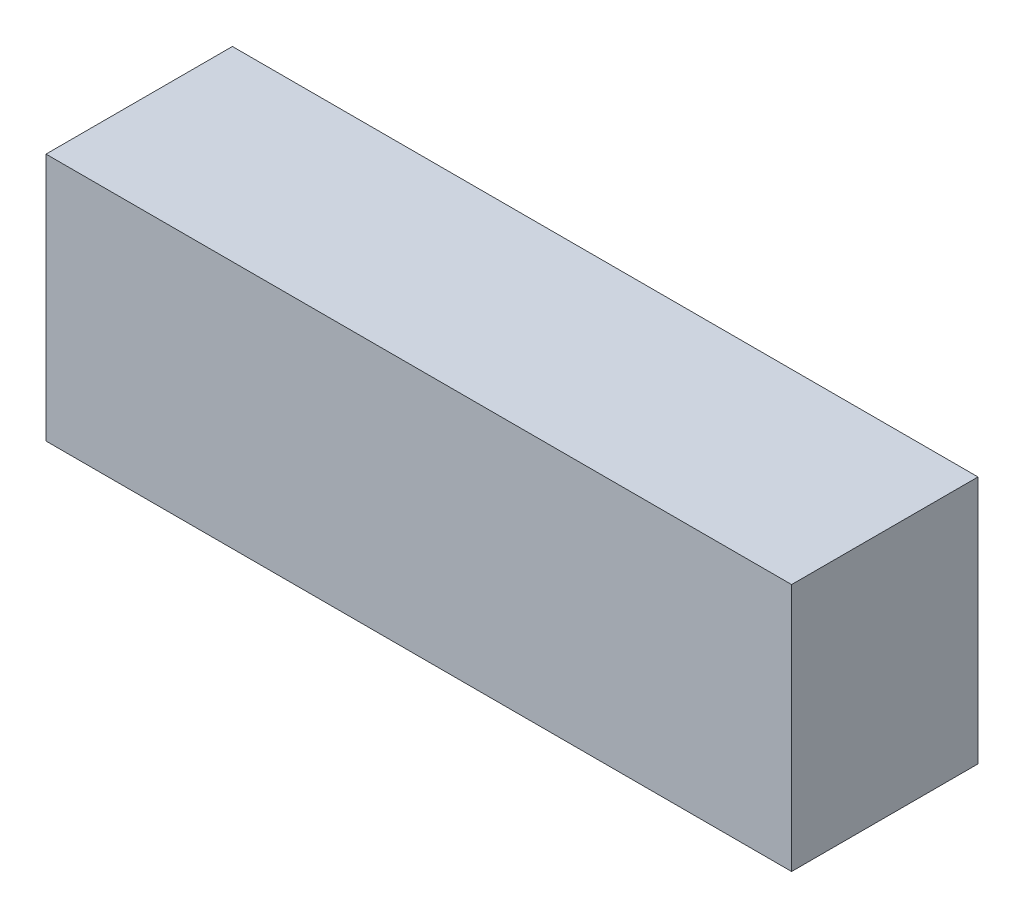
ISO-10303-21;
HEADER;
FILE_DESCRIPTION(('STEP AP214'),'2;1');
FILE_NAME('part.step','',(''),(''),'','','');
FILE_SCHEMA(('AUTOMOTIVE_DESIGN { 1 0 10303 214 1 1 1 1 }'));
ENDSEC;
DATA;
#1=APPLICATION_CONTEXT('core data for automotive mechanical design processes');
#2=APPLICATION_PROTOCOL_DEFINITION('international standard','automotive_design',2000,#1);
#3=PRODUCT_CONTEXT('',#1,'mechanical');
#4=PRODUCT('Part','Part','',(#3));
#5=PRODUCT_RELATED_PRODUCT_CATEGORY('part','',(#4));
#6=PRODUCT_DEFINITION_FORMATION('','',#4);
#7=PRODUCT_DEFINITION_CONTEXT('part definition',#1,'design');
#8=PRODUCT_DEFINITION('design','',#6,#7);
#9=PRODUCT_DEFINITION_SHAPE('','',#8);
#10=(LENGTH_UNIT() NAMED_UNIT(*) SI_UNIT(.MILLI.,.METRE.));
#11=(NAMED_UNIT(*) PLANE_ANGLE_UNIT() SI_UNIT($,.RADIAN.));
#12=(NAMED_UNIT(*) SI_UNIT($,.STERADIAN.) SOLID_ANGLE_UNIT());
#13=UNCERTAINTY_MEASURE_WITH_UNIT(LENGTH_MEASURE(1.E-05),#10,'distance_accuracy_value','');
#14=(GEOMETRIC_REPRESENTATION_CONTEXT(3) GLOBAL_UNCERTAINTY_ASSIGNED_CONTEXT((#13)) GLOBAL_UNIT_ASSIGNED_CONTEXT((#10,
#11,#12)) REPRESENTATION_CONTEXT('',''));
#15=CARTESIAN_POINT('',(0.,0.,0.));
#16=DIRECTION('',(0.,0.,1.));
#17=DIRECTION('',(1.,0.,0.));
#18=AXIS2_PLACEMENT_3D('',#15,#16,#17);
#19=CARTESIAN_POINT('',(19.05,6.35,9.525));
#20=DIRECTION('',(-1.,0.,0.));
#21=DIRECTION('',(0.,-1.,0.));
#22=AXIS2_PLACEMENT_3D('',#19,#20,#21);
#23=PLANE('',#22);
#24=DIRECTION('',(0.,1.,0.));
#25=VECTOR('',#24,1.);
#26=CARTESIAN_POINT('',(19.05,6.35,0.));
#27=LINE('',#26,#25);
#28=CARTESIAN_POINT('',(19.05,-6.35,0.));
#29=VERTEX_POINT('',#28);
#30=CARTESIAN_POINT('',(19.05,6.35,0.));
#31=VERTEX_POINT('',#30);
#32=EDGE_CURVE('E104',#29,#31,#27,.T.);
#33=ORIENTED_EDGE('',*,*,#32,.T.);
#34=DIRECTION('',(0.,0.,-1.));
#35=VECTOR('',#34,1.);
#36=CARTESIAN_POINT('',(19.05,6.35,9.525));
#37=LINE('',#36,#35);
#38=CARTESIAN_POINT('',(19.05,6.35,9.525));
#39=VERTEX_POINT('',#38);
#40=EDGE_CURVE('E11',#39,#31,#37,.T.);
#41=ORIENTED_EDGE('',*,*,#40,.F.);
#42=DIRECTION('',(0.,1.,0.));
#43=VECTOR('',#42,1.);
#44=CARTESIAN_POINT('',(19.05,6.35,9.525));
#45=LINE('',#44,#43);
#46=CARTESIAN_POINT('',(19.05,-6.35,9.525));
#47=VERTEX_POINT('',#46);
#48=EDGE_CURVE('E92',#47,#39,#45,.T.);
#49=ORIENTED_EDGE('',*,*,#48,.F.);
#50=DIRECTION('',(0.,0.,-1.));
#51=VECTOR('',#50,1.);
#52=CARTESIAN_POINT('',(19.05,-6.35,9.525));
#53=LINE('',#52,#51);
#54=EDGE_CURVE('E100',#47,#29,#53,.T.);
#55=ORIENTED_EDGE('',*,*,#54,.T.);
#56=EDGE_LOOP('',(#33,#41,#49,#55));
#57=FACE_BOUND('',#56,.T.);
#58=ADVANCED_FACE('F41',(#57),#23,.F.);
#59=CARTESIAN_POINT('',(-19.05,6.35,9.525));
#60=DIRECTION('',(0.,-1.,0.));
#61=DIRECTION('',(0.,0.,-1.));
#62=AXIS2_PLACEMENT_3D('',#59,#60,#61);
#63=PLANE('',#62);
#64=DIRECTION('',(-1.,0.,0.));
#65=VECTOR('',#64,1.);
#66=CARTESIAN_POINT('',(-19.05,6.35,0.));
#67=LINE('',#66,#65);
#68=CARTESIAN_POINT('',(-19.05,6.35,0.));
#69=VERTEX_POINT('',#68);
#70=EDGE_CURVE('E96',#31,#69,#67,.T.);
#71=ORIENTED_EDGE('',*,*,#70,.T.);
#72=DIRECTION('',(0.,0.,-1.));
#73=VECTOR('',#72,1.);
#74=CARTESIAN_POINT('',(-19.05,6.35,9.525));
#75=LINE('',#74,#73);
#76=CARTESIAN_POINT('',(-19.05,6.35,9.525));
#77=VERTEX_POINT('',#76);
#78=EDGE_CURVE('E49',#77,#69,#75,.T.);
#79=ORIENTED_EDGE('',*,*,#78,.F.);
#80=DIRECTION('',(-1.,0.,0.));
#81=VECTOR('',#80,1.);
#82=CARTESIAN_POINT('',(-19.05,6.35,9.525));
#83=LINE('',#82,#81);
#84=EDGE_CURVE('E87',#39,#77,#83,.T.);
#85=ORIENTED_EDGE('',*,*,#84,.F.);
#86=ORIENTED_EDGE('',*,*,#40,.T.);
#87=EDGE_LOOP('',(#71,#79,#85,#86));
#88=FACE_BOUND('',#87,.T.);
#89=ADVANCED_FACE('F95',(#88),#63,.F.);
#90=CARTESIAN_POINT('',(-19.05,6.35,9.525));
#91=DIRECTION('',(1.,0.,0.));
#92=DIRECTION('',(0.,0.,-1.));
#93=AXIS2_PLACEMENT_3D('',#90,#91,#92);
#94=PLANE('',#93);
#95=DIRECTION('',(0.,-1.,0.));
#96=VECTOR('',#95,1.);
#97=CARTESIAN_POINT('',(-19.05,6.35,0.));
#98=LINE('',#97,#96);
#99=CARTESIAN_POINT('',(-19.05,-6.35,0.));
#100=VERTEX_POINT('',#99);
#101=EDGE_CURVE('E74',#69,#100,#98,.T.);
#102=ORIENTED_EDGE('',*,*,#101,.T.);
#103=DIRECTION('',(0.,0.,-1.));
#104=VECTOR('',#103,1.);
#105=CARTESIAN_POINT('',(-19.05,-6.35,9.525));
#106=LINE('',#105,#104);
#107=CARTESIAN_POINT('',(-19.05,-6.35,9.525));
#108=VERTEX_POINT('',#107);
#109=EDGE_CURVE('E97',#108,#100,#106,.T.);
#110=ORIENTED_EDGE('',*,*,#109,.F.);
#111=DIRECTION('',(0.,-1.,0.));
#112=VECTOR('',#111,1.);
#113=CARTESIAN_POINT('',(-19.05,6.35,9.525));
#114=LINE('',#113,#112);
#115=EDGE_CURVE('E90',#77,#108,#114,.T.);
#116=ORIENTED_EDGE('',*,*,#115,.F.);
#117=ORIENTED_EDGE('',*,*,#78,.T.);
#118=EDGE_LOOP('',(#102,#110,#116,#117));
#119=FACE_BOUND('',#118,.T.);
#120=ADVANCED_FACE('F98',(#119),#94,.F.);
#121=CARTESIAN_POINT('',(-19.05,-6.35,9.525));
#122=DIRECTION('',(0.,1.,0.));
#123=DIRECTION('',(0.,0.,1.));
#124=AXIS2_PLACEMENT_3D('',#121,#122,#123);
#125=PLANE('',#124);
#126=DIRECTION('',(1.,0.,0.));
#127=VECTOR('',#126,1.);
#128=CARTESIAN_POINT('',(-19.05,-6.35,0.));
#129=LINE('',#128,#127);
#130=EDGE_CURVE('E80',#100,#29,#129,.T.);
#131=ORIENTED_EDGE('',*,*,#130,.T.);
#132=ORIENTED_EDGE('',*,*,#54,.F.);
#133=DIRECTION('',(1.,0.,0.));
#134=VECTOR('',#133,1.);
#135=CARTESIAN_POINT('',(-19.05,-6.35,9.525));
#136=LINE('',#135,#134);
#137=EDGE_CURVE('E57',#108,#47,#136,.T.);
#138=ORIENTED_EDGE('',*,*,#137,.F.);
#139=ORIENTED_EDGE('',*,*,#109,.T.);
#140=EDGE_LOOP('',(#131,#132,#138,#139));
#141=FACE_BOUND('',#140,.T.);
#142=ADVANCED_FACE('F111',(#141),#125,.F.);
#143=CARTESIAN_POINT('',(0.,0.,9.525));
#144=DIRECTION('',(0.,0.,1.));
#145=DIRECTION('',(1.,0.,0.));
#146=AXIS2_PLACEMENT_3D('',#143,#144,#145);
#147=PLANE('',#146);
#148=ORIENTED_EDGE('',*,*,#48,.T.);
#149=ORIENTED_EDGE('',*,*,#84,.T.);
#150=ORIENTED_EDGE('',*,*,#115,.T.);
#151=ORIENTED_EDGE('',*,*,#137,.T.);
#152=EDGE_LOOP('',(#148,#149,#150,#151));
#153=FACE_BOUND('',#152,.T.);
#154=ADVANCED_FACE('F88',(#153),#147,.T.);
#155=CARTESIAN_POINT('',(0.,0.,0.));
#156=DIRECTION('',(0.,0.,1.));
#157=DIRECTION('',(1.,0.,0.));
#158=AXIS2_PLACEMENT_3D('',#155,#156,#157);
#159=PLANE('',#158);
#160=ORIENTED_EDGE('',*,*,#32,.F.);
#161=ORIENTED_EDGE('',*,*,#130,.F.);
#162=ORIENTED_EDGE('',*,*,#101,.F.);
#163=ORIENTED_EDGE('',*,*,#70,.F.);
#164=EDGE_LOOP('',(#160,#161,#162,#163));
#165=FACE_BOUND('',#164,.T.);
#166=ADVANCED_FACE('F114',(#165),#159,.F.);
#167=CLOSED_SHELL('',(#58,#89,#120,#142,#154,#166));
#168=MANIFOLD_SOLID_BREP('B2',#167);
#169=ADVANCED_BREP_SHAPE_REPRESENTATION('',(#18,#168),#14);
#170=SHAPE_DEFINITION_REPRESENTATION(#9,#169);
ENDSEC;
END-ISO-10303-21;
